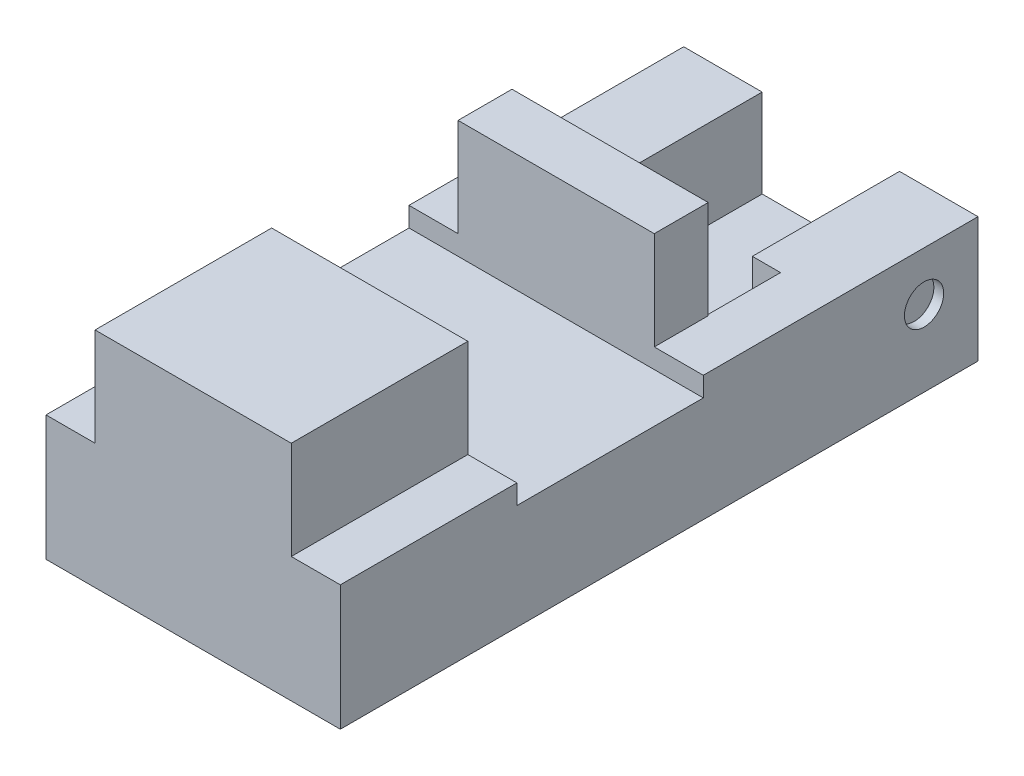
ISO-10303-21;
HEADER;
FILE_DESCRIPTION(('STEP AP214'),'2;1');
FILE_NAME('part.step','',(''),(''),'','','');
FILE_SCHEMA(('AUTOMOTIVE_DESIGN { 1 0 10303 214 1 1 1 1 }'));
ENDSEC;
DATA;
#1=APPLICATION_CONTEXT('core data for automotive mechanical design processes');
#2=APPLICATION_PROTOCOL_DEFINITION('international standard','automotive_design',2000,#1);
#3=PRODUCT_CONTEXT('',#1,'mechanical');
#4=PRODUCT('Part','Part','',(#3));
#5=PRODUCT_RELATED_PRODUCT_CATEGORY('part','',(#4));
#6=PRODUCT_DEFINITION_FORMATION('','',#4);
#7=PRODUCT_DEFINITION_CONTEXT('part definition',#1,'design');
#8=PRODUCT_DEFINITION('design','',#6,#7);
#9=PRODUCT_DEFINITION_SHAPE('','',#8);
#10=(LENGTH_UNIT() NAMED_UNIT(*) SI_UNIT(.MILLI.,.METRE.));
#11=(NAMED_UNIT(*) PLANE_ANGLE_UNIT() SI_UNIT($,.RADIAN.));
#12=(NAMED_UNIT(*) SI_UNIT($,.STERADIAN.) SOLID_ANGLE_UNIT());
#13=UNCERTAINTY_MEASURE_WITH_UNIT(LENGTH_MEASURE(1.E-05),#10,'distance_accuracy_value','');
#14=(GEOMETRIC_REPRESENTATION_CONTEXT(3) GLOBAL_UNCERTAINTY_ASSIGNED_CONTEXT((#13)) GLOBAL_UNIT_ASSIGNED_CONTEXT((#10,
#11,#12)) REPRESENTATION_CONTEXT('',''));
#15=CARTESIAN_POINT('',(0.,0.,0.));
#16=DIRECTION('',(0.,0.,1.));
#17=DIRECTION('',(1.,0.,0.));
#18=AXIS2_PLACEMENT_3D('',#15,#16,#17);
#19=CARTESIAN_POINT('',(0.,1.8,0.));
#20=DIRECTION('',(0.,-1.,0.));
#21=DIRECTION('',(0.,0.,-1.));
#22=AXIS2_PLACEMENT_3D('',#19,#20,#21);
#23=PLANE('',#22);
#24=DIRECTION('',(0.,0.,-1.));
#25=VECTOR('',#24,1.);
#26=CARTESIAN_POINT('',(2.,1.8,10.));
#27=LINE('',#26,#25);
#28=CARTESIAN_POINT('',(2.,1.8,10.));
#29=VERTEX_POINT('',#28);
#30=CARTESIAN_POINT('',(2.,1.8,6.4));
#31=VERTEX_POINT('',#30);
#32=EDGE_CURVE('E56',#29,#31,#27,.T.);
#33=ORIENTED_EDGE('',*,*,#32,.F.);
#34=DIRECTION('',(1.,0.,0.));
#35=VECTOR('',#34,1.);
#36=CARTESIAN_POINT('',(-3.,1.8,10.));
#37=LINE('',#36,#35);
#38=CARTESIAN_POINT('',(3.,1.8,10.));
#39=VERTEX_POINT('',#38);
#40=EDGE_CURVE('E216',#29,#39,#37,.T.);
#41=ORIENTED_EDGE('',*,*,#40,.T.);
#42=DIRECTION('',(0.,0.,-1.));
#43=VECTOR('',#42,1.);
#44=CARTESIAN_POINT('',(3.,1.8,-3.));
#45=LINE('',#44,#43);
#46=CARTESIAN_POINT('',(3.,1.8,6.4));
#47=VERTEX_POINT('',#46);
#48=EDGE_CURVE('E235',#39,#47,#45,.T.);
#49=ORIENTED_EDGE('',*,*,#48,.T.);
#50=DIRECTION('',(1.,0.,0.));
#51=VECTOR('',#50,1.);
#52=CARTESIAN_POINT('',(-3.,1.8,6.4));
#53=LINE('',#52,#51);
#54=EDGE_CURVE('E218',#31,#47,#53,.T.);
#55=ORIENTED_EDGE('',*,*,#54,.F.);
#56=EDGE_LOOP('',(#33,#41,#49,#55));
#57=FACE_BOUND('',#56,.T.);
#58=ADVANCED_FACE('F41',(#57),#23,.F.);
#59=DIRECTION('',(0.,0.,1.));
#60=VECTOR('',#59,1.);
#61=CARTESIAN_POINT('',(-2.,1.8,6.4));
#62=LINE('',#61,#60);
#63=CARTESIAN_POINT('',(-2.,1.8,6.4));
#64=VERTEX_POINT('',#63);
#65=CARTESIAN_POINT('',(-2.,1.8,10.));
#66=VERTEX_POINT('',#65);
#67=EDGE_CURVE('E219',#64,#66,#62,.T.);
#68=ORIENTED_EDGE('',*,*,#67,.F.);
#69=CARTESIAN_POINT('',(-3.,1.8,6.4));
#70=VERTEX_POINT('',#69);
#71=EDGE_CURVE('E338',#70,#64,#53,.T.);
#72=ORIENTED_EDGE('',*,*,#71,.F.);
#73=DIRECTION('',(0.,0.,1.));
#74=VECTOR('',#73,1.);
#75=CARTESIAN_POINT('',(-3.,1.8,10.));
#76=LINE('',#75,#74);
#77=CARTESIAN_POINT('',(-3.,1.8,10.));
#78=VERTEX_POINT('',#77);
#79=EDGE_CURVE('E231',#70,#78,#76,.T.);
#80=ORIENTED_EDGE('',*,*,#79,.T.);
#81=EDGE_CURVE('E225',#78,#66,#37,.T.);
#82=ORIENTED_EDGE('',*,*,#81,.T.);
#83=EDGE_LOOP('',(#68,#72,#80,#82));
#84=FACE_BOUND('',#83,.T.);
#85=ADVANCED_FACE('F336',(#84),#23,.F.);
#86=DIRECTION('',(0.,0.,-1.));
#87=VECTOR('',#86,1.);
#88=CARTESIAN_POINT('',(2.,1.8,2.6));
#89=LINE('',#88,#87);
#90=CARTESIAN_POINT('',(2.,1.8,2.6));
#91=VERTEX_POINT('',#90);
#92=CARTESIAN_POINT('',(2.,1.8,1.5));
#93=VERTEX_POINT('',#92);
#94=EDGE_CURVE('E394',#91,#93,#89,.T.);
#95=ORIENTED_EDGE('',*,*,#94,.F.);
#96=DIRECTION('',(-1.,0.,0.));
#97=VECTOR('',#96,1.);
#98=CARTESIAN_POINT('',(-3.,1.8,2.6));
#99=LINE('',#98,#97);
#100=CARTESIAN_POINT('',(3.,1.8,2.6));
#101=VERTEX_POINT('',#100);
#102=EDGE_CURVE('E350',#101,#91,#99,.T.);
#103=ORIENTED_EDGE('',*,*,#102,.F.);
#104=CARTESIAN_POINT('',(3.,1.8,-3.));
#105=VERTEX_POINT('',#104);
#106=EDGE_CURVE('E229',#101,#105,#45,.T.);
#107=ORIENTED_EDGE('',*,*,#106,.T.);
#108=DIRECTION('',(-1.,0.,0.));
#109=VECTOR('',#108,1.);
#110=CARTESIAN_POINT('',(1.4,1.8,-3.));
#111=LINE('',#110,#109);
#112=CARTESIAN_POINT('',(1.4,1.8,-3.));
#113=VERTEX_POINT('',#112);
#114=EDGE_CURVE('E237',#105,#113,#111,.T.);
#115=ORIENTED_EDGE('',*,*,#114,.T.);
#116=DIRECTION('',(0.,0.,1.));
#117=VECTOR('',#116,1.);
#118=CARTESIAN_POINT('',(1.4,1.8,0.));
#119=LINE('',#118,#117);
#120=CARTESIAN_POINT('',(1.4,1.8,0.));
#121=VERTEX_POINT('',#120);
#122=EDGE_CURVE('E239',#113,#121,#119,.T.);
#123=ORIENTED_EDGE('',*,*,#122,.T.);
#124=DIRECTION('',(1.,0.,0.));
#125=VECTOR('',#124,1.);
#126=CARTESIAN_POINT('',(1.975,1.8,0.));
#127=LINE('',#126,#125);
#128=CARTESIAN_POINT('',(1.975,1.8,0.));
#129=VERTEX_POINT('',#128);
#130=EDGE_CURVE('E241',#121,#129,#127,.T.);
#131=ORIENTED_EDGE('',*,*,#130,.T.);
#132=DIRECTION('',(0.,0.,1.));
#133=VECTOR('',#132,1.);
#134=CARTESIAN_POINT('',(1.975,1.8,1.5));
#135=LINE('',#134,#133);
#136=CARTESIAN_POINT('',(1.975,1.8,1.5));
#137=VERTEX_POINT('',#136);
#138=EDGE_CURVE('E243',#129,#137,#135,.T.);
#139=ORIENTED_EDGE('',*,*,#138,.T.);
#140=DIRECTION('',(-1.,0.,0.));
#141=VECTOR('',#140,1.);
#142=CARTESIAN_POINT('',(-2.,1.8,1.5));
#143=LINE('',#142,#141);
#144=EDGE_CURVE('E422',#93,#137,#143,.T.);
#145=ORIENTED_EDGE('',*,*,#144,.F.);
#146=EDGE_LOOP('',(#95,#103,#107,#115,#123,#131,#139,#145));
#147=FACE_BOUND('',#146,.T.);
#148=ADVANCED_FACE('F391',(#147),#23,.F.);
#149=DIRECTION('',(0.,0.,1.));
#150=VECTOR('',#149,1.);
#151=CARTESIAN_POINT('',(-2.,1.8,1.5));
#152=LINE('',#151,#150);
#153=CARTESIAN_POINT('',(-2.,1.8,1.5));
#154=VERTEX_POINT('',#153);
#155=CARTESIAN_POINT('',(-2.,1.8,2.6));
#156=VERTEX_POINT('',#155);
#157=EDGE_CURVE('E64',#154,#156,#152,.T.);
#158=ORIENTED_EDGE('',*,*,#157,.F.);
#159=CARTESIAN_POINT('',(-1.975,1.8,1.5));
#160=VERTEX_POINT('',#159);
#161=EDGE_CURVE('E421',#160,#154,#143,.T.);
#162=ORIENTED_EDGE('',*,*,#161,.F.);
#163=DIRECTION('',(0.,0.,-1.));
#164=VECTOR('',#163,1.);
#165=CARTESIAN_POINT('',(-1.975,1.8,0.));
#166=LINE('',#165,#164);
#167=CARTESIAN_POINT('',(-1.975,1.8,0.));
#168=VERTEX_POINT('',#167);
#169=EDGE_CURVE('E246',#160,#168,#166,.T.);
#170=ORIENTED_EDGE('',*,*,#169,.T.);
#171=DIRECTION('',(1.,0.,0.));
#172=VECTOR('',#171,1.);
#173=CARTESIAN_POINT('',(-1.4,1.8,0.));
#174=LINE('',#173,#172);
#175=CARTESIAN_POINT('',(-1.4,1.8,0.));
#176=VERTEX_POINT('',#175);
#177=EDGE_CURVE('E248',#168,#176,#174,.T.);
#178=ORIENTED_EDGE('',*,*,#177,.T.);
#179=DIRECTION('',(0.,0.,-1.));
#180=VECTOR('',#179,1.);
#181=CARTESIAN_POINT('',(-1.4,1.8,-3.));
#182=LINE('',#181,#180);
#183=CARTESIAN_POINT('',(-1.4,1.8,-3.));
#184=VERTEX_POINT('',#183);
#185=EDGE_CURVE('E250',#176,#184,#182,.T.);
#186=ORIENTED_EDGE('',*,*,#185,.T.);
#187=DIRECTION('',(-1.,0.,0.));
#188=VECTOR('',#187,1.);
#189=CARTESIAN_POINT('',(-3.,1.8,-3.));
#190=LINE('',#189,#188);
#191=CARTESIAN_POINT('',(-3.,1.8,-3.));
#192=VERTEX_POINT('',#191);
#193=EDGE_CURVE('E275',#184,#192,#190,.T.);
#194=ORIENTED_EDGE('',*,*,#193,.T.);
#195=CARTESIAN_POINT('',(-3.,1.8,2.6));
#196=VERTEX_POINT('',#195);
#197=EDGE_CURVE('E226',#192,#196,#76,.T.);
#198=ORIENTED_EDGE('',*,*,#197,.T.);
#199=EDGE_CURVE('E367',#156,#196,#99,.T.);
#200=ORIENTED_EDGE('',*,*,#199,.F.);
#201=EDGE_LOOP('',(#158,#162,#170,#178,#186,#194,#198,#200));
#202=FACE_BOUND('',#201,.T.);
#203=ADVANCED_FACE('F452',(#202),#23,.F.);
#204=CARTESIAN_POINT('',(-3.,1.8,10.));
#205=DIRECTION('',(1.,0.,0.));
#206=DIRECTION('',(0.,0.,-1.));
#207=AXIS2_PLACEMENT_3D('',#204,#205,#206);
#208=PLANE('',#207);
#209=CARTESIAN_POINT('',(-3.,0.8,-1.9));
#210=DIRECTION('',(1.,0.,0.));
#211=DIRECTION('',(0.,0.,-1.));
#212=AXIS2_PLACEMENT_3D('',#209,#210,#211);
#213=CIRCLE('',#212,0.4);
#214=CARTESIAN_POINT('',(-3.,0.8,-2.3));
#215=VERTEX_POINT('',#214);
#216=EDGE_CURVE('E379',#215,#215,#213,.T.);
#217=ORIENTED_EDGE('',*,*,#216,.T.);
#218=EDGE_LOOP('',(#217));
#219=FACE_BOUND('',#218,.T.);
#220=ORIENTED_EDGE('',*,*,#79,.F.);
#221=DIRECTION('',(0.,1.,0.));
#222=VECTOR('',#221,1.);
#223=CARTESIAN_POINT('',(-3.,1.4,6.4));
#224=LINE('',#223,#222);
#225=CARTESIAN_POINT('',(-3.,1.4,6.4));
#226=VERTEX_POINT('',#225);
#227=EDGE_CURVE('E324',#226,#70,#224,.T.);
#228=ORIENTED_EDGE('',*,*,#227,.F.);
#229=DIRECTION('',(0.,0.,1.));
#230=VECTOR('',#229,1.);
#231=CARTESIAN_POINT('',(-3.,1.4,2.6));
#232=LINE('',#231,#230);
#233=CARTESIAN_POINT('',(-3.,1.4,2.6));
#234=VERTEX_POINT('',#233);
#235=EDGE_CURVE('E343',#234,#226,#232,.T.);
#236=ORIENTED_EDGE('',*,*,#235,.F.);
#237=DIRECTION('',(0.,1.,0.));
#238=VECTOR('',#237,1.);
#239=CARTESIAN_POINT('',(-3.,1.4,2.6));
#240=LINE('',#239,#238);
#241=EDGE_CURVE('E345',#234,#196,#240,.T.);
#242=ORIENTED_EDGE('',*,*,#241,.T.);
#243=ORIENTED_EDGE('',*,*,#197,.F.);
#244=DIRECTION('',(0.,-1.,0.));
#245=VECTOR('',#244,1.);
#246=CARTESIAN_POINT('',(-3.,1.8,-3.));
#247=LINE('',#246,#245);
#248=CARTESIAN_POINT('',(-3.,-0.75,-3.));
#249=VERTEX_POINT('',#248);
#250=EDGE_CURVE('E11',#192,#249,#247,.T.);
#251=ORIENTED_EDGE('',*,*,#250,.T.);
#252=DIRECTION('',(0.,0.,-1.));
#253=VECTOR('',#252,1.);
#254=CARTESIAN_POINT('',(-3.,-0.75,-3.));
#255=LINE('',#254,#253);
#256=CARTESIAN_POINT('',(-3.,-0.75,10.));
#257=VERTEX_POINT('',#256);
#258=EDGE_CURVE('E313',#257,#249,#255,.T.);
#259=ORIENTED_EDGE('',*,*,#258,.F.);
#260=DIRECTION('',(0.,-1.,0.));
#261=VECTOR('',#260,1.);
#262=CARTESIAN_POINT('',(-3.,1.8,10.));
#263=LINE('',#262,#261);
#264=EDGE_CURVE('E49',#78,#257,#263,.T.);
#265=ORIENTED_EDGE('',*,*,#264,.F.);
#266=EDGE_LOOP('',(#220,#228,#236,#242,#243,#251,#259,#265));
#267=FACE_BOUND('',#266,.T.);
#268=ADVANCED_FACE('F43',(#219,#267),#208,.F.);
#269=CARTESIAN_POINT('',(-3.,1.8,10.));
#270=DIRECTION('',(0.,0.,-1.));
#271=DIRECTION('',(-1.,0.,0.));
#272=AXIS2_PLACEMENT_3D('',#269,#270,#271);
#273=PLANE('',#272);
#274=ORIENTED_EDGE('',*,*,#264,.T.);
#275=DIRECTION('',(-1.,0.,0.));
#276=VECTOR('',#275,1.);
#277=CARTESIAN_POINT('',(-3.,-0.75,10.));
#278=LINE('',#277,#276);
#279=CARTESIAN_POINT('',(3.,-0.75,10.));
#280=VERTEX_POINT('',#279);
#281=EDGE_CURVE('E257',#280,#257,#278,.T.);
#282=ORIENTED_EDGE('',*,*,#281,.F.);
#283=DIRECTION('',(0.,-1.,0.));
#284=VECTOR('',#283,1.);
#285=CARTESIAN_POINT('',(3.,1.8,10.));
#286=LINE('',#285,#284);
#287=EDGE_CURVE('E223',#39,#280,#286,.T.);
#288=ORIENTED_EDGE('',*,*,#287,.F.);
#289=ORIENTED_EDGE('',*,*,#40,.F.);
#290=DIRECTION('',(0.,-1.,0.));
#291=VECTOR('',#290,1.);
#292=CARTESIAN_POINT('',(2.,3.8,10.));
#293=LINE('',#292,#291);
#294=CARTESIAN_POINT('',(2.,3.8,10.));
#295=VERTEX_POINT('',#294);
#296=EDGE_CURVE('E203',#295,#29,#293,.T.);
#297=ORIENTED_EDGE('',*,*,#296,.F.);
#298=DIRECTION('',(1.,0.,0.));
#299=VECTOR('',#298,1.);
#300=CARTESIAN_POINT('',(-2.,3.8,10.));
#301=LINE('',#300,#299);
#302=CARTESIAN_POINT('',(-2.,3.8,10.));
#303=VERTEX_POINT('',#302);
#304=EDGE_CURVE('E210',#303,#295,#301,.T.);
#305=ORIENTED_EDGE('',*,*,#304,.F.);
#306=DIRECTION('',(0.,-1.,0.));
#307=VECTOR('',#306,1.);
#308=CARTESIAN_POINT('',(-2.,3.8,10.));
#309=LINE('',#308,#307);
#310=EDGE_CURVE('E211',#303,#66,#309,.T.);
#311=ORIENTED_EDGE('',*,*,#310,.T.);
#312=ORIENTED_EDGE('',*,*,#81,.F.);
#313=EDGE_LOOP('',(#274,#282,#288,#289,#297,#305,#311,#312));
#314=FACE_BOUND('',#313,.T.);
#315=ADVANCED_FACE('F221',(#314),#273,.F.);
#316=CARTESIAN_POINT('',(3.,1.8,-3.));
#317=DIRECTION('',(-1.,0.,0.));
#318=DIRECTION('',(0.,0.,1.));
#319=AXIS2_PLACEMENT_3D('',#316,#317,#318);
#320=PLANE('',#319);
#321=CARTESIAN_POINT('',(3.,0.8,-1.9));
#322=DIRECTION('',(1.,0.,0.));
#323=DIRECTION('',(0.,0.,-1.));
#324=AXIS2_PLACEMENT_3D('',#321,#322,#323);
#325=CIRCLE('',#324,0.4);
#326=CARTESIAN_POINT('',(3.,0.8,-2.3));
#327=VERTEX_POINT('',#326);
#328=EDGE_CURVE('E371',#327,#327,#325,.T.);
#329=ORIENTED_EDGE('',*,*,#328,.F.);
#330=EDGE_LOOP('',(#329));
#331=FACE_BOUND('',#330,.T.);
#332=DIRECTION('',(0.,0.,-1.));
#333=VECTOR('',#332,1.);
#334=CARTESIAN_POINT('',(3.,1.4,6.4));
#335=LINE('',#334,#333);
#336=CARTESIAN_POINT('',(3.,1.4,6.4));
#337=VERTEX_POINT('',#336);
#338=CARTESIAN_POINT('',(3.,1.4,2.6));
#339=VERTEX_POINT('',#338);
#340=EDGE_CURVE('E364',#337,#339,#335,.T.);
#341=ORIENTED_EDGE('',*,*,#340,.F.);
#342=DIRECTION('',(0.,1.,0.));
#343=VECTOR('',#342,1.);
#344=CARTESIAN_POINT('',(3.,1.4,6.4));
#345=LINE('',#344,#343);
#346=EDGE_CURVE('E327',#337,#47,#345,.T.);
#347=ORIENTED_EDGE('',*,*,#346,.T.);
#348=ORIENTED_EDGE('',*,*,#48,.F.);
#349=ORIENTED_EDGE('',*,*,#287,.T.);
#350=DIRECTION('',(0.,0.,1.));
#351=VECTOR('',#350,1.);
#352=CARTESIAN_POINT('',(3.,-0.75,10.));
#353=LINE('',#352,#351);
#354=CARTESIAN_POINT('',(3.,-0.75,-3.));
#355=VERTEX_POINT('',#354);
#356=EDGE_CURVE('E315',#355,#280,#353,.T.);
#357=ORIENTED_EDGE('',*,*,#356,.F.);
#358=DIRECTION('',(0.,-1.,0.));
#359=VECTOR('',#358,1.);
#360=CARTESIAN_POINT('',(3.,1.8,-3.));
#361=LINE('',#360,#359);
#362=EDGE_CURVE('E299',#105,#355,#361,.T.);
#363=ORIENTED_EDGE('',*,*,#362,.F.);
#364=ORIENTED_EDGE('',*,*,#106,.F.);
#365=DIRECTION('',(0.,1.,0.));
#366=VECTOR('',#365,1.);
#367=CARTESIAN_POINT('',(3.,1.4,2.6));
#368=LINE('',#367,#366);
#369=EDGE_CURVE('E347',#339,#101,#368,.T.);
#370=ORIENTED_EDGE('',*,*,#369,.F.);
#371=EDGE_LOOP('',(#341,#347,#348,#349,#357,#363,#364,#370));
#372=FACE_BOUND('',#371,.T.);
#373=ADVANCED_FACE('F386',(#331,#372),#320,.F.);
#374=CARTESIAN_POINT('',(1.4,1.8,-3.));
#375=DIRECTION('',(0.,0.,1.));
#376=DIRECTION('',(1.,0.,0.));
#377=AXIS2_PLACEMENT_3D('',#374,#375,#376);
#378=PLANE('',#377);
#379=ORIENTED_EDGE('',*,*,#362,.T.);
#380=DIRECTION('',(1.,0.,0.));
#381=VECTOR('',#380,1.);
#382=CARTESIAN_POINT('',(-3.,-0.75,-3.));
#383=LINE('',#382,#381);
#384=EDGE_CURVE('E319',#249,#355,#383,.T.);
#385=ORIENTED_EDGE('',*,*,#384,.F.);
#386=ORIENTED_EDGE('',*,*,#250,.F.);
#387=ORIENTED_EDGE('',*,*,#193,.F.);
#388=DIRECTION('',(0.,-1.,0.));
#389=VECTOR('',#388,1.);
#390=CARTESIAN_POINT('',(-1.4,1.8,-3.));
#391=LINE('',#390,#389);
#392=CARTESIAN_POINT('',(-1.4,0.,-3.));
#393=VERTEX_POINT('',#392);
#394=EDGE_CURVE('E252',#184,#393,#391,.T.);
#395=ORIENTED_EDGE('',*,*,#394,.T.);
#396=DIRECTION('',(1.,0.,0.));
#397=VECTOR('',#396,1.);
#398=CARTESIAN_POINT('',(-3.,0.,-3.));
#399=LINE('',#398,#397);
#400=CARTESIAN_POINT('',(1.4,0.,-3.));
#401=VERTEX_POINT('',#400);
#402=EDGE_CURVE('E320',#393,#401,#399,.T.);
#403=ORIENTED_EDGE('',*,*,#402,.T.);
#404=DIRECTION('',(0.,-1.,0.));
#405=VECTOR('',#404,1.);
#406=CARTESIAN_POINT('',(1.4,1.8,-3.));
#407=LINE('',#406,#405);
#408=EDGE_CURVE('E296',#113,#401,#407,.T.);
#409=ORIENTED_EDGE('',*,*,#408,.F.);
#410=ORIENTED_EDGE('',*,*,#114,.F.);
#411=EDGE_LOOP('',(#379,#385,#386,#387,#395,#403,#409,#410));
#412=FACE_BOUND('',#411,.T.);
#413=ADVANCED_FACE('F700',(#412),#378,.F.);
#414=CARTESIAN_POINT('',(1.4,1.8,0.));
#415=DIRECTION('',(1.,0.,0.));
#416=DIRECTION('',(0.,0.,-1.));
#417=AXIS2_PLACEMENT_3D('',#414,#415,#416);
#418=PLANE('',#417);
#419=DIRECTION('',(0.,0.,1.));
#420=VECTOR('',#419,1.);
#421=CARTESIAN_POINT('',(1.4,0.,0.));
#422=LINE('',#421,#420);
#423=CARTESIAN_POINT('',(1.4,0.,0.));
#424=VERTEX_POINT('',#423);
#425=EDGE_CURVE('E253',#401,#424,#422,.T.);
#426=ORIENTED_EDGE('',*,*,#425,.T.);
#427=DIRECTION('',(0.,-1.,0.));
#428=VECTOR('',#427,1.);
#429=CARTESIAN_POINT('',(1.4,1.8,0.));
#430=LINE('',#429,#428);
#431=EDGE_CURVE('E293',#121,#424,#430,.T.);
#432=ORIENTED_EDGE('',*,*,#431,.F.);
#433=ORIENTED_EDGE('',*,*,#122,.F.);
#434=ORIENTED_EDGE('',*,*,#408,.T.);
#435=EDGE_LOOP('',(#426,#432,#433,#434));
#436=FACE_BOUND('',#435,.T.);
#437=ADVANCED_FACE('F716',(#436),#418,.F.);
#438=CARTESIAN_POINT('',(1.975,1.8,0.));
#439=DIRECTION('',(0.,0.,-1.));
#440=DIRECTION('',(-1.,0.,0.));
#441=AXIS2_PLACEMENT_3D('',#438,#439,#440);
#442=PLANE('',#441);
#443=DIRECTION('',(1.,0.,0.));
#444=VECTOR('',#443,1.);
#445=CARTESIAN_POINT('',(1.975,0.,0.));
#446=LINE('',#445,#444);
#447=CARTESIAN_POINT('',(1.975,0.,0.));
#448=VERTEX_POINT('',#447);
#449=EDGE_CURVE('E256',#424,#448,#446,.T.);
#450=ORIENTED_EDGE('',*,*,#449,.T.);
#451=DIRECTION('',(0.,-1.,0.));
#452=VECTOR('',#451,1.);
#453=CARTESIAN_POINT('',(1.975,1.8,0.));
#454=LINE('',#453,#452);
#455=EDGE_CURVE('E290',#129,#448,#454,.T.);
#456=ORIENTED_EDGE('',*,*,#455,.F.);
#457=ORIENTED_EDGE('',*,*,#130,.F.);
#458=ORIENTED_EDGE('',*,*,#431,.T.);
#459=EDGE_LOOP('',(#450,#456,#457,#458));
#460=FACE_BOUND('',#459,.T.);
#461=ADVANCED_FACE('F725',(#460),#442,.F.);
#462=CARTESIAN_POINT('',(1.975,1.8,1.5));
#463=DIRECTION('',(1.,0.,0.));
#464=DIRECTION('',(0.,0.,-1.));
#465=AXIS2_PLACEMENT_3D('',#462,#463,#464);
#466=PLANE('',#465);
#467=DIRECTION('',(0.,0.,1.));
#468=VECTOR('',#467,1.);
#469=CARTESIAN_POINT('',(1.975,0.,1.5));
#470=LINE('',#469,#468);
#471=CARTESIAN_POINT('',(1.975,0.,1.5));
#472=VERTEX_POINT('',#471);
#473=EDGE_CURVE('E260',#448,#472,#470,.T.);
#474=ORIENTED_EDGE('',*,*,#473,.T.);
#475=DIRECTION('',(0.,-1.,0.));
#476=VECTOR('',#475,1.);
#477=CARTESIAN_POINT('',(1.975,1.8,1.5));
#478=LINE('',#477,#476);
#479=EDGE_CURVE('E287',#137,#472,#478,.T.);
#480=ORIENTED_EDGE('',*,*,#479,.F.);
#481=ORIENTED_EDGE('',*,*,#138,.F.);
#482=ORIENTED_EDGE('',*,*,#455,.T.);
#483=EDGE_LOOP('',(#474,#480,#481,#482));
#484=FACE_BOUND('',#483,.T.);
#485=ADVANCED_FACE('F597',(#484),#466,.F.);
#486=CARTESIAN_POINT('',(-1.975,1.8,1.5));
#487=DIRECTION('',(0.,0.,1.));
#488=DIRECTION('',(1.,0.,0.));
#489=AXIS2_PLACEMENT_3D('',#486,#487,#488);
#490=PLANE('',#489);
#491=DIRECTION('',(-1.,0.,0.));
#492=VECTOR('',#491,1.);
#493=CARTESIAN_POINT('',(-1.975,0.,1.5));
#494=LINE('',#493,#492);
#495=CARTESIAN_POINT('',(-1.975,0.,1.5));
#496=VERTEX_POINT('',#495);
#497=EDGE_CURVE('E263',#472,#496,#494,.T.);
#498=ORIENTED_EDGE('',*,*,#497,.T.);
#499=DIRECTION('',(0.,-1.,0.));
#500=VECTOR('',#499,1.);
#501=CARTESIAN_POINT('',(-1.975,1.8,1.5));
#502=LINE('',#501,#500);
#503=EDGE_CURVE('E284',#160,#496,#502,.T.);
#504=ORIENTED_EDGE('',*,*,#503,.F.);
#505=ORIENTED_EDGE('',*,*,#161,.T.);
#506=DIRECTION('',(0.,-1.,0.));
#507=VECTOR('',#506,1.);
#508=CARTESIAN_POINT('',(-2.,3.8,1.5));
#509=LINE('',#508,#507);
#510=CARTESIAN_POINT('',(-2.,3.8,1.5));
#511=VERTEX_POINT('',#510);
#512=EDGE_CURVE('E413',#511,#154,#509,.T.);
#513=ORIENTED_EDGE('',*,*,#512,.F.);
#514=DIRECTION('',(-1.,0.,0.));
#515=VECTOR('',#514,1.);
#516=CARTESIAN_POINT('',(-2.,3.8,1.5));
#517=LINE('',#516,#515);
#518=CARTESIAN_POINT('',(2.,3.8,1.5));
#519=VERTEX_POINT('',#518);
#520=EDGE_CURVE('E411',#519,#511,#517,.T.);
#521=ORIENTED_EDGE('',*,*,#520,.F.);
#522=DIRECTION('',(0.,-1.,0.));
#523=VECTOR('',#522,1.);
#524=CARTESIAN_POINT('',(2.,3.8,1.5));
#525=LINE('',#524,#523);
#526=EDGE_CURVE('E403',#519,#93,#525,.T.);
#527=ORIENTED_EDGE('',*,*,#526,.T.);
#528=ORIENTED_EDGE('',*,*,#144,.T.);
#529=ORIENTED_EDGE('',*,*,#479,.T.);
#530=EDGE_LOOP('',(#498,#504,#505,#513,#521,#527,#528,#529));
#531=FACE_BOUND('',#530,.T.);
#532=ADVANCED_FACE('F589',(#531),#490,.F.);
#533=CARTESIAN_POINT('',(-1.975,1.8,0.));
#534=DIRECTION('',(-1.,0.,0.));
#535=DIRECTION('',(0.,0.,1.));
#536=AXIS2_PLACEMENT_3D('',#533,#534,#535);
#537=PLANE('',#536);
#538=DIRECTION('',(0.,0.,-1.));
#539=VECTOR('',#538,1.);
#540=CARTESIAN_POINT('',(-1.975,0.,0.));
#541=LINE('',#540,#539);
#542=CARTESIAN_POINT('',(-1.975,0.,0.));
#543=VERTEX_POINT('',#542);
#544=EDGE_CURVE('E266',#496,#543,#541,.T.);
#545=ORIENTED_EDGE('',*,*,#544,.T.);
#546=DIRECTION('',(0.,-1.,0.));
#547=VECTOR('',#546,1.);
#548=CARTESIAN_POINT('',(-1.975,1.8,0.));
#549=LINE('',#548,#547);
#550=EDGE_CURVE('E281',#168,#543,#549,.T.);
#551=ORIENTED_EDGE('',*,*,#550,.F.);
#552=ORIENTED_EDGE('',*,*,#169,.F.);
#553=ORIENTED_EDGE('',*,*,#503,.T.);
#554=EDGE_LOOP('',(#545,#551,#552,#553));
#555=FACE_BOUND('',#554,.T.);
#556=ADVANCED_FACE('F596',(#555),#537,.F.);
#557=CARTESIAN_POINT('',(-1.4,1.8,0.));
#558=DIRECTION('',(0.,0.,-1.));
#559=DIRECTION('',(-1.,0.,0.));
#560=AXIS2_PLACEMENT_3D('',#557,#558,#559);
#561=PLANE('',#560);
#562=DIRECTION('',(1.,0.,0.));
#563=VECTOR('',#562,1.);
#564=CARTESIAN_POINT('',(-1.4,0.,0.));
#565=LINE('',#564,#563);
#566=CARTESIAN_POINT('',(-1.4,0.,0.));
#567=VERTEX_POINT('',#566);
#568=EDGE_CURVE('E269',#543,#567,#565,.T.);
#569=ORIENTED_EDGE('',*,*,#568,.T.);
#570=DIRECTION('',(0.,-1.,0.));
#571=VECTOR('',#570,1.);
#572=CARTESIAN_POINT('',(-1.4,1.8,0.));
#573=LINE('',#572,#571);
#574=EDGE_CURVE('E278',#176,#567,#573,.T.);
#575=ORIENTED_EDGE('',*,*,#574,.F.);
#576=ORIENTED_EDGE('',*,*,#177,.F.);
#577=ORIENTED_EDGE('',*,*,#550,.T.);
#578=EDGE_LOOP('',(#569,#575,#576,#577));
#579=FACE_BOUND('',#578,.T.);
#580=ADVANCED_FACE('F753',(#579),#561,.F.);
#581=CARTESIAN_POINT('',(-1.4,1.8,-3.));
#582=DIRECTION('',(-1.,0.,0.));
#583=DIRECTION('',(0.,0.,1.));
#584=AXIS2_PLACEMENT_3D('',#581,#582,#583);
#585=PLANE('',#584);
#586=DIRECTION('',(0.,0.,-1.));
#587=VECTOR('',#586,1.);
#588=CARTESIAN_POINT('',(-1.4,0.,-3.));
#589=LINE('',#588,#587);
#590=EDGE_CURVE('E272',#567,#393,#589,.T.);
#591=ORIENTED_EDGE('',*,*,#590,.T.);
#592=ORIENTED_EDGE('',*,*,#394,.F.);
#593=ORIENTED_EDGE('',*,*,#185,.F.);
#594=ORIENTED_EDGE('',*,*,#574,.T.);
#595=EDGE_LOOP('',(#591,#592,#593,#594));
#596=FACE_BOUND('',#595,.T.);
#597=ADVANCED_FACE('F761',(#596),#585,.F.);
#598=CARTESIAN_POINT('',(0.,0.,0.));
#599=DIRECTION('',(0.,1.,0.));
#600=DIRECTION('',(0.,0.,1.));
#601=AXIS2_PLACEMENT_3D('',#598,#599,#600);
#602=PLANE('',#601);
#603=ORIENTED_EDGE('',*,*,#590,.F.);
#604=ORIENTED_EDGE('',*,*,#568,.F.);
#605=ORIENTED_EDGE('',*,*,#544,.F.);
#606=ORIENTED_EDGE('',*,*,#497,.F.);
#607=ORIENTED_EDGE('',*,*,#473,.F.);
#608=ORIENTED_EDGE('',*,*,#449,.F.);
#609=ORIENTED_EDGE('',*,*,#425,.F.);
#610=ORIENTED_EDGE('',*,*,#402,.F.);
#611=EDGE_LOOP('',(#603,#604,#605,#606,#607,#608,#609,#610));
#612=FACE_BOUND('',#611,.T.);
#613=ADVANCED_FACE('F771',(#612),#602,.T.);
#614=CARTESIAN_POINT('',(0.,-0.75,0.));
#615=DIRECTION('',(0.,1.,0.));
#616=DIRECTION('',(0.,0.,1.));
#617=AXIS2_PLACEMENT_3D('',#614,#615,#616);
#618=PLANE('',#617);
#619=ORIENTED_EDGE('',*,*,#258,.T.);
#620=ORIENTED_EDGE('',*,*,#384,.T.);
#621=ORIENTED_EDGE('',*,*,#356,.T.);
#622=ORIENTED_EDGE('',*,*,#281,.T.);
#623=EDGE_LOOP('',(#619,#620,#621,#622));
#624=FACE_BOUND('',#623,.T.);
#625=ADVANCED_FACE('F311',(#624),#618,.F.);
#626=CARTESIAN_POINT('',(-3.,1.4,6.4));
#627=DIRECTION('',(0.,0.,1.));
#628=DIRECTION('',(1.,0.,0.));
#629=AXIS2_PLACEMENT_3D('',#626,#627,#628);
#630=PLANE('',#629);
#631=ORIENTED_EDGE('',*,*,#71,.T.);
#632=DIRECTION('',(0.,-1.,0.));
#633=VECTOR('',#632,1.);
#634=CARTESIAN_POINT('',(-2.,3.8,6.4));
#635=LINE('',#634,#633);
#636=CARTESIAN_POINT('',(-2.,3.8,6.4));
#637=VERTEX_POINT('',#636);
#638=EDGE_CURVE('E475',#637,#64,#635,.T.);
#639=ORIENTED_EDGE('',*,*,#638,.F.);
#640=DIRECTION('',(-1.,0.,0.));
#641=VECTOR('',#640,1.);
#642=CARTESIAN_POINT('',(-2.,3.8,6.4));
#643=LINE('',#642,#641);
#644=CARTESIAN_POINT('',(2.,3.8,6.4));
#645=VERTEX_POINT('',#644);
#646=EDGE_CURVE('E468',#645,#637,#643,.T.);
#647=ORIENTED_EDGE('',*,*,#646,.F.);
#648=DIRECTION('',(0.,-1.,0.));
#649=VECTOR('',#648,1.);
#650=CARTESIAN_POINT('',(2.,3.8,6.4));
#651=LINE('',#650,#649);
#652=EDGE_CURVE('E477',#645,#31,#651,.T.);
#653=ORIENTED_EDGE('',*,*,#652,.T.);
#654=ORIENTED_EDGE('',*,*,#54,.T.);
#655=ORIENTED_EDGE('',*,*,#346,.F.);
#656=DIRECTION('',(1.,0.,0.));
#657=VECTOR('',#656,1.);
#658=CARTESIAN_POINT('',(-3.,1.4,6.4));
#659=LINE('',#658,#657);
#660=EDGE_CURVE('E382',#226,#337,#659,.T.);
#661=ORIENTED_EDGE('',*,*,#660,.F.);
#662=ORIENTED_EDGE('',*,*,#227,.T.);
#663=EDGE_LOOP('',(#631,#639,#647,#653,#654,#655,#661,#662));
#664=FACE_BOUND('',#663,.T.);
#665=ADVANCED_FACE('F478',(#664),#630,.F.);
#666=CARTESIAN_POINT('',(-3.,1.4,2.6));
#667=DIRECTION('',(0.,0.,-1.));
#668=DIRECTION('',(-1.,0.,0.));
#669=AXIS2_PLACEMENT_3D('',#666,#667,#668);
#670=PLANE('',#669);
#671=ORIENTED_EDGE('',*,*,#102,.T.);
#672=DIRECTION('',(0.,-1.,0.));
#673=VECTOR('',#672,1.);
#674=CARTESIAN_POINT('',(2.,3.8,2.6));
#675=LINE('',#674,#673);
#676=CARTESIAN_POINT('',(2.,3.8,2.6));
#677=VERTEX_POINT('',#676);
#678=EDGE_CURVE('E397',#677,#91,#675,.T.);
#679=ORIENTED_EDGE('',*,*,#678,.F.);
#680=DIRECTION('',(1.,0.,0.));
#681=VECTOR('',#680,1.);
#682=CARTESIAN_POINT('',(-2.,3.8,2.6));
#683=LINE('',#682,#681);
#684=CARTESIAN_POINT('',(-2.,3.8,2.6));
#685=VERTEX_POINT('',#684);
#686=EDGE_CURVE('E399',#685,#677,#683,.T.);
#687=ORIENTED_EDGE('',*,*,#686,.F.);
#688=DIRECTION('',(0.,-1.,0.));
#689=VECTOR('',#688,1.);
#690=CARTESIAN_POINT('',(-2.,3.8,2.6));
#691=LINE('',#690,#689);
#692=EDGE_CURVE('E402',#685,#156,#691,.T.);
#693=ORIENTED_EDGE('',*,*,#692,.T.);
#694=ORIENTED_EDGE('',*,*,#199,.T.);
#695=ORIENTED_EDGE('',*,*,#241,.F.);
#696=DIRECTION('',(-1.,0.,0.));
#697=VECTOR('',#696,1.);
#698=CARTESIAN_POINT('',(-3.,1.4,2.6));
#699=LINE('',#698,#697);
#700=EDGE_CURVE('E359',#339,#234,#699,.T.);
#701=ORIENTED_EDGE('',*,*,#700,.F.);
#702=ORIENTED_EDGE('',*,*,#369,.T.);
#703=EDGE_LOOP('',(#671,#679,#687,#693,#694,#695,#701,#702));
#704=FACE_BOUND('',#703,.T.);
#705=ADVANCED_FACE('F396',(#704),#670,.F.);
#706=CARTESIAN_POINT('',(0.,1.4,0.));
#707=DIRECTION('',(0.,1.,0.));
#708=DIRECTION('',(0.,0.,1.));
#709=AXIS2_PLACEMENT_3D('',#706,#707,#708);
#710=PLANE('',#709);
#711=ORIENTED_EDGE('',*,*,#660,.T.);
#712=ORIENTED_EDGE('',*,*,#340,.T.);
#713=ORIENTED_EDGE('',*,*,#700,.T.);
#714=ORIENTED_EDGE('',*,*,#235,.T.);
#715=EDGE_LOOP('',(#711,#712,#713,#714));
#716=FACE_BOUND('',#715,.T.);
#717=ADVANCED_FACE('F384',(#716),#710,.T.);
#718=CARTESIAN_POINT('',(2.8,0.8,-1.9));
#719=DIRECTION('',(1.,0.,0.));
#720=DIRECTION('',(0.,0.,-1.));
#721=AXIS2_PLACEMENT_3D('',#718,#719,#720);
#722=CYLINDRICAL_SURFACE('',#721,0.4);
#723=CARTESIAN_POINT('',(2.8,0.8,-1.9));
#724=DIRECTION('',(1.,0.,0.));
#725=DIRECTION('',(0.,0.,-1.));
#726=AXIS2_PLACEMENT_3D('',#723,#724,#725);
#727=CIRCLE('',#726,0.4);
#728=CARTESIAN_POINT('',(2.8,0.8,-2.3));
#729=VERTEX_POINT('',#728);
#730=EDGE_CURVE('E369',#729,#729,#727,.T.);
#731=ORIENTED_EDGE('',*,*,#730,.F.);
#732=EDGE_LOOP('',(#731));
#733=FACE_BOUND('',#732,.T.);
#734=ORIENTED_EDGE('',*,*,#328,.T.);
#735=EDGE_LOOP('',(#734));
#736=FACE_BOUND('',#735,.T.);
#737=ADVANCED_FACE('F445',(#733,#736),#722,.F.);
#738=CARTESIAN_POINT('',(2.8,0.8,-1.9));
#739=DIRECTION('',(1.,0.,0.));
#740=DIRECTION('',(0.,0.,-1.));
#741=AXIS2_PLACEMENT_3D('',#738,#739,#740);
#742=PLANE('',#741);
#743=ORIENTED_EDGE('',*,*,#730,.T.);
#744=EDGE_LOOP('',(#743));
#745=FACE_BOUND('',#744,.T.);
#746=ADVANCED_FACE('F436',(#745),#742,.T.);
#747=CARTESIAN_POINT('',(-2.8,0.8,-1.9));
#748=DIRECTION('',(-1.,0.,0.));
#749=DIRECTION('',(0.,0.,1.));
#750=AXIS2_PLACEMENT_3D('',#747,#748,#749);
#751=CYLINDRICAL_SURFACE('',#750,0.4);
#752=CARTESIAN_POINT('',(-2.8,0.8,-1.9));
#753=DIRECTION('',(1.,0.,0.));
#754=DIRECTION('',(0.,0.,-1.));
#755=AXIS2_PLACEMENT_3D('',#752,#753,#754);
#756=CIRCLE('',#755,0.4);
#757=CARTESIAN_POINT('',(-2.8,0.8,-2.3));
#758=VERTEX_POINT('',#757);
#759=EDGE_CURVE('E376',#758,#758,#756,.T.);
#760=ORIENTED_EDGE('',*,*,#759,.T.);
#761=EDGE_LOOP('',(#760));
#762=FACE_BOUND('',#761,.T.);
#763=ORIENTED_EDGE('',*,*,#216,.F.);
#764=EDGE_LOOP('',(#763));
#765=FACE_BOUND('',#764,.T.);
#766=ADVANCED_FACE('F433',(#762,#765),#751,.F.);
#767=CARTESIAN_POINT('',(-2.8,0.8,-1.9));
#768=DIRECTION('',(-1.,0.,0.));
#769=DIRECTION('',(0.,0.,-1.));
#770=AXIS2_PLACEMENT_3D('',#767,#768,#769);
#771=PLANE('',#770);
#772=ORIENTED_EDGE('',*,*,#759,.F.);
#773=EDGE_LOOP('',(#772));
#774=FACE_BOUND('',#773,.T.);
#775=ADVANCED_FACE('F435',(#774),#771,.T.);
#776=CARTESIAN_POINT('',(-2.,3.8,1.5));
#777=DIRECTION('',(1.,0.,0.));
#778=DIRECTION('',(0.,0.,-1.));
#779=AXIS2_PLACEMENT_3D('',#776,#777,#778);
#780=PLANE('',#779);
#781=ORIENTED_EDGE('',*,*,#157,.T.);
#782=ORIENTED_EDGE('',*,*,#692,.F.);
#783=DIRECTION('',(0.,0.,1.));
#784=VECTOR('',#783,1.);
#785=CARTESIAN_POINT('',(-2.,3.8,1.5));
#786=LINE('',#785,#784);
#787=EDGE_CURVE('E415',#511,#685,#786,.T.);
#788=ORIENTED_EDGE('',*,*,#787,.F.);
#789=ORIENTED_EDGE('',*,*,#512,.T.);
#790=EDGE_LOOP('',(#781,#782,#788,#789));
#791=FACE_BOUND('',#790,.T.);
#792=ADVANCED_FACE('F442',(#791),#780,.F.);
#793=CARTESIAN_POINT('',(2.,3.8,2.6));
#794=DIRECTION('',(-1.,0.,0.));
#795=DIRECTION('',(0.,0.,1.));
#796=AXIS2_PLACEMENT_3D('',#793,#794,#795);
#797=PLANE('',#796);
#798=ORIENTED_EDGE('',*,*,#94,.T.);
#799=ORIENTED_EDGE('',*,*,#526,.F.);
#800=DIRECTION('',(0.,0.,-1.));
#801=VECTOR('',#800,1.);
#802=CARTESIAN_POINT('',(2.,3.8,2.6));
#803=LINE('',#802,#801);
#804=EDGE_CURVE('E406',#677,#519,#803,.T.);
#805=ORIENTED_EDGE('',*,*,#804,.F.);
#806=ORIENTED_EDGE('',*,*,#678,.T.);
#807=EDGE_LOOP('',(#798,#799,#805,#806));
#808=FACE_BOUND('',#807,.T.);
#809=ADVANCED_FACE('F407',(#808),#797,.F.);
#810=CARTESIAN_POINT('',(0.,3.8,0.));
#811=DIRECTION('',(0.,1.,0.));
#812=DIRECTION('',(0.,0.,1.));
#813=AXIS2_PLACEMENT_3D('',#810,#811,#812);
#814=PLANE('',#813);
#815=ORIENTED_EDGE('',*,*,#787,.T.);
#816=ORIENTED_EDGE('',*,*,#686,.T.);
#817=ORIENTED_EDGE('',*,*,#804,.T.);
#818=ORIENTED_EDGE('',*,*,#520,.T.);
#819=EDGE_LOOP('',(#815,#816,#817,#818));
#820=FACE_BOUND('',#819,.T.);
#821=ADVANCED_FACE('F492',(#820),#814,.T.);
#822=CARTESIAN_POINT('',(2.,3.8,10.));
#823=DIRECTION('',(-1.,0.,0.));
#824=DIRECTION('',(0.,0.,1.));
#825=AXIS2_PLACEMENT_3D('',#822,#823,#824);
#826=PLANE('',#825);
#827=ORIENTED_EDGE('',*,*,#32,.T.);
#828=ORIENTED_EDGE('',*,*,#652,.F.);
#829=DIRECTION('',(0.,0.,-1.));
#830=VECTOR('',#829,1.);
#831=CARTESIAN_POINT('',(2.,3.8,10.));
#832=LINE('',#831,#830);
#833=EDGE_CURVE('E206',#295,#645,#832,.T.);
#834=ORIENTED_EDGE('',*,*,#833,.F.);
#835=ORIENTED_EDGE('',*,*,#296,.T.);
#836=EDGE_LOOP('',(#827,#828,#834,#835));
#837=FACE_BOUND('',#836,.T.);
#838=ADVANCED_FACE('F204',(#837),#826,.F.);
#839=CARTESIAN_POINT('',(-2.,3.8,6.4));
#840=DIRECTION('',(1.,0.,0.));
#841=DIRECTION('',(0.,0.,-1.));
#842=AXIS2_PLACEMENT_3D('',#839,#840,#841);
#843=PLANE('',#842);
#844=ORIENTED_EDGE('',*,*,#67,.T.);
#845=ORIENTED_EDGE('',*,*,#310,.F.);
#846=DIRECTION('',(0.,0.,1.));
#847=VECTOR('',#846,1.);
#848=CARTESIAN_POINT('',(-2.,3.8,6.4));
#849=LINE('',#848,#847);
#850=EDGE_CURVE('E470',#637,#303,#849,.T.);
#851=ORIENTED_EDGE('',*,*,#850,.F.);
#852=ORIENTED_EDGE('',*,*,#638,.T.);
#853=EDGE_LOOP('',(#844,#845,#851,#852));
#854=FACE_BOUND('',#853,.T.);
#855=ADVANCED_FACE('F484',(#854),#843,.F.);
#856=CARTESIAN_POINT('',(0.,3.8,0.));
#857=DIRECTION('',(0.,-1.,0.));
#858=DIRECTION('',(0.,0.,-1.));
#859=AXIS2_PLACEMENT_3D('',#856,#857,#858);
#860=PLANE('',#859);
#861=ORIENTED_EDGE('',*,*,#833,.T.);
#862=ORIENTED_EDGE('',*,*,#646,.T.);
#863=ORIENTED_EDGE('',*,*,#850,.T.);
#864=ORIENTED_EDGE('',*,*,#304,.T.);
#865=EDGE_LOOP('',(#861,#862,#863,#864));
#866=FACE_BOUND('',#865,.T.);
#867=ADVANCED_FACE('F481',(#866),#860,.F.);
#868=CLOSED_SHELL('',(#58,#85,#148,#203,#268,#315,#373,#413,#437,#461,#485,#532,#556,#580,#597,
#613,#625,#665,#705,#717,#737,#746,#766,#775,#792,#809,#821,#838,#855,#867));
#869=MANIFOLD_SOLID_BREP('B2',#868);
#870=ADVANCED_BREP_SHAPE_REPRESENTATION('',(#18,#869),#14);
#871=SHAPE_DEFINITION_REPRESENTATION(#9,#870);
ENDSEC;
END-ISO-10303-21;
